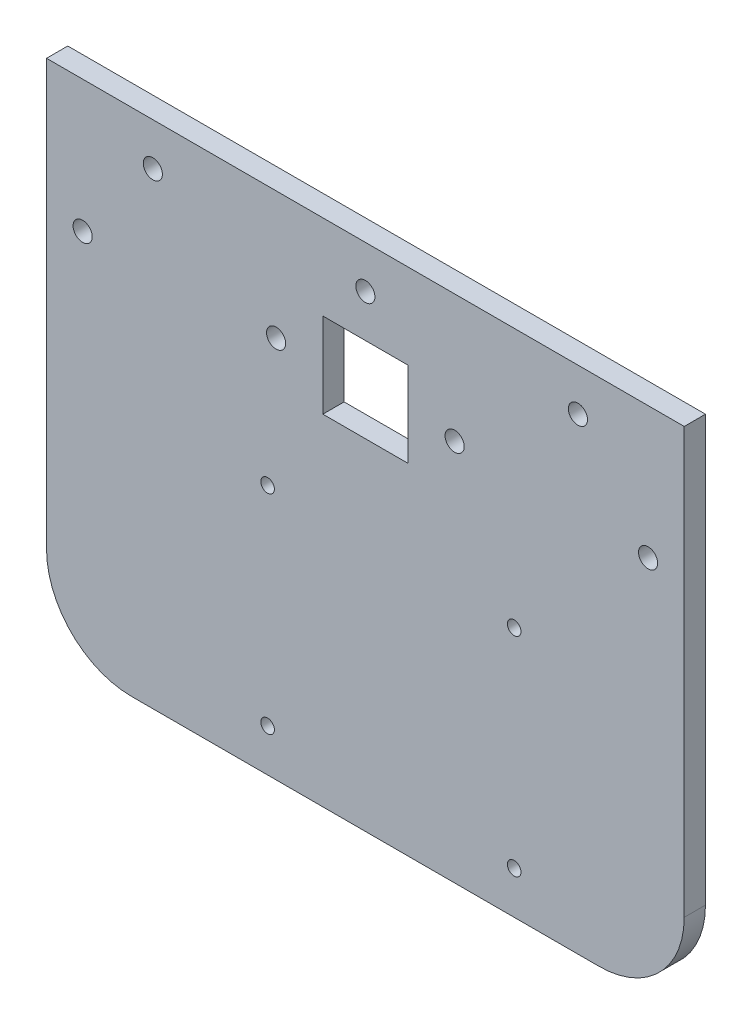
ISO-10303-21;
HEADER;
FILE_DESCRIPTION(('STEP AP214'),'2;1');
FILE_NAME('part.step','',(''),(''),'','','');
FILE_SCHEMA(('AUTOMOTIVE_DESIGN { 1 0 10303 214 1 1 1 1 }'));
ENDSEC;
DATA;
#1=APPLICATION_CONTEXT('core data for automotive mechanical design processes');
#2=APPLICATION_PROTOCOL_DEFINITION('international standard','automotive_design',2000,#1);
#3=PRODUCT_CONTEXT('',#1,'mechanical');
#4=PRODUCT('Part','Part','',(#3));
#5=PRODUCT_RELATED_PRODUCT_CATEGORY('part','',(#4));
#6=PRODUCT_DEFINITION_FORMATION('','',#4);
#7=PRODUCT_DEFINITION_CONTEXT('part definition',#1,'design');
#8=PRODUCT_DEFINITION('design','',#6,#7);
#9=PRODUCT_DEFINITION_SHAPE('','',#8);
#10=(LENGTH_UNIT() NAMED_UNIT(*) SI_UNIT(.MILLI.,.METRE.));
#11=(NAMED_UNIT(*) PLANE_ANGLE_UNIT() SI_UNIT($,.RADIAN.));
#12=(NAMED_UNIT(*) SI_UNIT($,.STERADIAN.) SOLID_ANGLE_UNIT());
#13=UNCERTAINTY_MEASURE_WITH_UNIT(LENGTH_MEASURE(1.E-05),#10,'distance_accuracy_value','');
#14=(GEOMETRIC_REPRESENTATION_CONTEXT(3) GLOBAL_UNCERTAINTY_ASSIGNED_CONTEXT((#13)) GLOBAL_UNIT_ASSIGNED_CONTEXT((#10,
#11,#12)) REPRESENTATION_CONTEXT('',''));
#15=CARTESIAN_POINT('',(0.,0.,0.));
#16=DIRECTION('',(0.,0.,1.));
#17=DIRECTION('',(1.,0.,0.));
#18=AXIS2_PLACEMENT_3D('',#15,#16,#17);
#19=CARTESIAN_POINT('',(20.,-100.,5.));
#20=DIRECTION('',(0.,0.,1.));
#21=DIRECTION('',(1.,0.,0.));
#22=AXIS2_PLACEMENT_3D('',#19,#20,#21);
#23=PLANE('',#22);
#24=CARTESIAN_POINT('',(54.,-30.,5.));
#25=DIRECTION('',(0.,0.,1.));
#26=DIRECTION('',(1.,0.,0.));
#27=AXIS2_PLACEMENT_3D('',#24,#25,#26);
#28=CIRCLE('',#27,2.25);
#29=CARTESIAN_POINT('',(56.25,-30.,5.));
#30=VERTEX_POINT('',#29);
#31=EDGE_CURVE('E339',#30,#30,#28,.T.);
#32=ORIENTED_EDGE('',*,*,#31,.F.);
#33=EDGE_LOOP('',(#32));
#34=FACE_BOUND('',#33,.T.);
#35=CARTESIAN_POINT('',(125.,-9.99999999999999,5.));
#36=DIRECTION('',(0.,0.,1.));
#37=DIRECTION('',(1.,0.,0.));
#38=AXIS2_PLACEMENT_3D('',#35,#36,#37);
#39=CIRCLE('',#38,2.25000000000001);
#40=CARTESIAN_POINT('',(127.25,-9.99999999999999,5.));
#41=VERTEX_POINT('',#40);
#42=EDGE_CURVE('E355',#41,#41,#39,.T.);
#43=ORIENTED_EDGE('',*,*,#42,.F.);
#44=EDGE_LOOP('',(#43));
#45=FACE_BOUND('',#44,.T.);
#46=CARTESIAN_POINT('',(141.5,-31.,5.));
#47=DIRECTION('',(0.,0.,1.));
#48=DIRECTION('',(1.,0.,0.));
#49=AXIS2_PLACEMENT_3D('',#46,#47,#48);
#50=CIRCLE('',#49,2.25000000000001);
#51=CARTESIAN_POINT('',(143.75,-31.,5.));
#52=VERTEX_POINT('',#51);
#53=EDGE_CURVE('E371',#52,#52,#50,.T.);
#54=ORIENTED_EDGE('',*,*,#53,.F.);
#55=EDGE_LOOP('',(#54));
#56=FACE_BOUND('',#55,.T.);
#57=CARTESIAN_POINT('',(52.,-110.,5.));
#58=DIRECTION('',(0.,0.,1.));
#59=DIRECTION('',(1.,0.,0.));
#60=AXIS2_PLACEMENT_3D('',#57,#58,#59);
#61=CIRCLE('',#60,1.6);
#62=CARTESIAN_POINT('',(53.6,-110.,5.));
#63=VERTEX_POINT('',#62);
#64=EDGE_CURVE('E387',#63,#63,#61,.T.);
#65=ORIENTED_EDGE('',*,*,#64,.F.);
#66=EDGE_LOOP('',(#65));
#67=FACE_BOUND('',#66,.T.);
#68=CARTESIAN_POINT('',(110.,-61.,5.));
#69=DIRECTION('',(0.,0.,1.));
#70=DIRECTION('',(1.,0.,0.));
#71=AXIS2_PLACEMENT_3D('',#68,#69,#70);
#72=CIRCLE('',#71,1.60000000000001);
#73=CARTESIAN_POINT('',(111.6,-61.,5.));
#74=VERTEX_POINT('',#73);
#75=EDGE_CURVE('E403',#74,#74,#72,.T.);
#76=ORIENTED_EDGE('',*,*,#75,.F.);
#77=EDGE_LOOP('',(#76));
#78=FACE_BOUND('',#77,.T.);
#79=DIRECTION('',(1.,0.,0.));
#80=VECTOR('',#79,1.);
#81=CARTESIAN_POINT('',(65.,-40.,5.));
#82=LINE('',#81,#80);
#83=CARTESIAN_POINT('',(65.,-40.,5.));
#84=VERTEX_POINT('',#83);
#85=CARTESIAN_POINT('',(85.,-40.,5.));
#86=VERTEX_POINT('',#85);
#87=EDGE_CURVE('E126',#84,#86,#82,.T.);
#88=ORIENTED_EDGE('',*,*,#87,.F.);
#89=DIRECTION('',(0.,-1.,0.));
#90=VECTOR('',#89,1.);
#91=CARTESIAN_POINT('',(65.,-20.,5.));
#92=LINE('',#91,#90);
#93=CARTESIAN_POINT('',(65.,-20.,5.));
#94=VERTEX_POINT('',#93);
#95=EDGE_CURVE('E117',#94,#84,#92,.T.);
#96=ORIENTED_EDGE('',*,*,#95,.F.);
#97=DIRECTION('',(-1.,0.,0.));
#98=VECTOR('',#97,1.);
#99=CARTESIAN_POINT('',(65.,-20.,5.));
#100=LINE('',#99,#98);
#101=CARTESIAN_POINT('',(85.,-20.,5.));
#102=VERTEX_POINT('',#101);
#103=EDGE_CURVE('E144',#102,#94,#100,.T.);
#104=ORIENTED_EDGE('',*,*,#103,.F.);
#105=DIRECTION('',(0.,1.,0.));
#106=VECTOR('',#105,1.);
#107=CARTESIAN_POINT('',(85.,-20.,5.));
#108=LINE('',#107,#106);
#109=EDGE_CURVE('E140',#86,#102,#108,.T.);
#110=ORIENTED_EDGE('',*,*,#109,.F.);
#111=EDGE_LOOP('',(#88,#96,#104,#110));
#112=FACE_BOUND('',#111,.T.);
#113=DIRECTION('',(0.,-1.,0.));
#114=VECTOR('',#113,1.);
#115=CARTESIAN_POINT('',(0.,0.,5.));
#116=LINE('',#115,#114);
#117=CARTESIAN_POINT('',(0.,0.,5.));
#118=VERTEX_POINT('',#117);
#119=CARTESIAN_POINT('',(0.,-100.,5.));
#120=VERTEX_POINT('',#119);
#121=EDGE_CURVE('E168',#118,#120,#116,.T.);
#122=ORIENTED_EDGE('',*,*,#121,.T.);
#123=CARTESIAN_POINT('',(20.,-100.,5.));
#124=DIRECTION('',(0.,0.,1.));
#125=DIRECTION('',(1.,0.,0.));
#126=AXIS2_PLACEMENT_3D('',#123,#124,#125);
#127=CIRCLE('',#126,20.);
#128=CARTESIAN_POINT('',(20.,-120.,5.));
#129=VERTEX_POINT('',#128);
#130=EDGE_CURVE('E172',#120,#129,#127,.T.);
#131=ORIENTED_EDGE('',*,*,#130,.T.);
#132=DIRECTION('',(1.,0.,0.));
#133=VECTOR('',#132,1.);
#134=CARTESIAN_POINT('',(20.,-120.,5.));
#135=LINE('',#134,#133);
#136=CARTESIAN_POINT('',(130.,-120.,5.));
#137=VERTEX_POINT('',#136);
#138=EDGE_CURVE('E176',#129,#137,#135,.T.);
#139=ORIENTED_EDGE('',*,*,#138,.T.);
#140=CARTESIAN_POINT('',(130.,-100.,5.));
#141=DIRECTION('',(0.,0.,1.));
#142=DIRECTION('',(1.,0.,0.));
#143=AXIS2_PLACEMENT_3D('',#140,#141,#142);
#144=CIRCLE('',#143,20.);
#145=CARTESIAN_POINT('',(150.,-100.,5.));
#146=VERTEX_POINT('',#145);
#147=EDGE_CURVE('E179',#137,#146,#144,.T.);
#148=ORIENTED_EDGE('',*,*,#147,.T.);
#149=DIRECTION('',(0.,1.,0.));
#150=VECTOR('',#149,1.);
#151=CARTESIAN_POINT('',(150.,0.,5.));
#152=LINE('',#151,#150);
#153=CARTESIAN_POINT('',(150.,0.,5.));
#154=VERTEX_POINT('',#153);
#155=EDGE_CURVE('E182',#146,#154,#152,.T.);
#156=ORIENTED_EDGE('',*,*,#155,.T.);
#157=DIRECTION('',(-1.,0.,0.));
#158=VECTOR('',#157,1.);
#159=CARTESIAN_POINT('',(0.,0.,5.));
#160=LINE('',#159,#158);
#161=EDGE_CURVE('E185',#154,#118,#160,.T.);
#162=ORIENTED_EDGE('',*,*,#161,.T.);
#163=EDGE_LOOP('',(#122,#131,#139,#148,#156,#162));
#164=FACE_BOUND('',#163,.T.);
#165=CARTESIAN_POINT('',(52.,-61.,5.));
#166=DIRECTION('',(0.,0.,1.));
#167=DIRECTION('',(1.,0.,0.));
#168=AXIS2_PLACEMENT_3D('',#165,#166,#167);
#169=CIRCLE('',#168,1.6);
#170=CARTESIAN_POINT('',(53.6,-61.,5.));
#171=VERTEX_POINT('',#170);
#172=EDGE_CURVE('E152',#171,#171,#169,.T.);
#173=ORIENTED_EDGE('',*,*,#172,.F.);
#174=EDGE_LOOP('',(#173));
#175=FACE_BOUND('',#174,.T.);
#176=CARTESIAN_POINT('',(110.,-110.,5.));
#177=DIRECTION('',(0.,0.,1.));
#178=DIRECTION('',(1.,0.,0.));
#179=AXIS2_PLACEMENT_3D('',#176,#177,#178);
#180=CIRCLE('',#179,1.60000000000001);
#181=CARTESIAN_POINT('',(111.6,-110.,5.));
#182=VERTEX_POINT('',#181);
#183=EDGE_CURVE('E395',#182,#182,#180,.T.);
#184=ORIENTED_EDGE('',*,*,#183,.F.);
#185=EDGE_LOOP('',(#184));
#186=FACE_BOUND('',#185,.T.);
#187=CARTESIAN_POINT('',(8.5,-31.,5.));
#188=DIRECTION('',(0.,0.,1.));
#189=DIRECTION('',(1.,0.,0.));
#190=AXIS2_PLACEMENT_3D('',#187,#188,#189);
#191=CIRCLE('',#190,2.25);
#192=CARTESIAN_POINT('',(10.75,-31.,5.));
#193=VERTEX_POINT('',#192);
#194=EDGE_CURVE('E379',#193,#193,#191,.T.);
#195=ORIENTED_EDGE('',*,*,#194,.F.);
#196=EDGE_LOOP('',(#195));
#197=FACE_BOUND('',#196,.T.);
#198=CARTESIAN_POINT('',(25.,-10.,5.));
#199=DIRECTION('',(0.,0.,1.));
#200=DIRECTION('',(1.,0.,0.));
#201=AXIS2_PLACEMENT_3D('',#198,#199,#200);
#202=CIRCLE('',#201,2.25);
#203=CARTESIAN_POINT('',(27.25,-10.,5.));
#204=VERTEX_POINT('',#203);
#205=EDGE_CURVE('E363',#204,#204,#202,.T.);
#206=ORIENTED_EDGE('',*,*,#205,.F.);
#207=EDGE_LOOP('',(#206));
#208=FACE_BOUND('',#207,.T.);
#209=CARTESIAN_POINT('',(96.,-30.,5.));
#210=DIRECTION('',(0.,0.,1.));
#211=DIRECTION('',(1.,0.,0.));
#212=AXIS2_PLACEMENT_3D('',#209,#210,#211);
#213=CIRCLE('',#212,2.25);
#214=CARTESIAN_POINT('',(98.25,-30.,5.));
#215=VERTEX_POINT('',#214);
#216=EDGE_CURVE('E347',#215,#215,#213,.T.);
#217=ORIENTED_EDGE('',*,*,#216,.F.);
#218=EDGE_LOOP('',(#217));
#219=FACE_BOUND('',#218,.T.);
#220=CARTESIAN_POINT('',(75.,-9.99999999999999,5.));
#221=DIRECTION('',(0.,0.,1.));
#222=DIRECTION('',(1.,0.,0.));
#223=AXIS2_PLACEMENT_3D('',#220,#221,#222);
#224=CIRCLE('',#223,2.25);
#225=CARTESIAN_POINT('',(77.25,-9.99999999999999,5.));
#226=VERTEX_POINT('',#225);
#227=EDGE_CURVE('E328',#226,#226,#224,.T.);
#228=ORIENTED_EDGE('',*,*,#227,.F.);
#229=EDGE_LOOP('',(#228));
#230=FACE_BOUND('',#229,.T.);
#231=ADVANCED_FACE('F39',(#34,#45,#56,#67,#78,#112,#164,#175,#186,#197,#208,#219,#230),#23,.T.);
#232=CARTESIAN_POINT('',(20.,-100.,0.));
#233=DIRECTION('',(0.,0.,1.));
#234=DIRECTION('',(1.,0.,0.));
#235=AXIS2_PLACEMENT_3D('',#232,#233,#234);
#236=PLANE('',#235);
#237=DIRECTION('',(0.,-1.,0.));
#238=VECTOR('',#237,1.);
#239=CARTESIAN_POINT('',(0.,0.,0.));
#240=LINE('',#239,#238);
#241=CARTESIAN_POINT('',(0.,0.,0.));
#242=VERTEX_POINT('',#241);
#243=CARTESIAN_POINT('',(0.,-100.,0.));
#244=VERTEX_POINT('',#243);
#245=EDGE_CURVE('E135',#242,#244,#240,.T.);
#246=ORIENTED_EDGE('',*,*,#245,.F.);
#247=DIRECTION('',(-1.,0.,0.));
#248=VECTOR('',#247,1.);
#249=CARTESIAN_POINT('',(0.,0.,0.));
#250=LINE('',#249,#248);
#251=CARTESIAN_POINT('',(150.,0.,0.));
#252=VERTEX_POINT('',#251);
#253=EDGE_CURVE('E173',#252,#242,#250,.T.);
#254=ORIENTED_EDGE('',*,*,#253,.F.);
#255=DIRECTION('',(0.,1.,0.));
#256=VECTOR('',#255,1.);
#257=CARTESIAN_POINT('',(150.,0.,0.));
#258=LINE('',#257,#256);
#259=CARTESIAN_POINT('',(150.,-100.,0.));
#260=VERTEX_POINT('',#259);
#261=EDGE_CURVE('E201',#260,#252,#258,.T.);
#262=ORIENTED_EDGE('',*,*,#261,.F.);
#263=CARTESIAN_POINT('',(130.,-100.,0.));
#264=DIRECTION('',(0.,0.,1.));
#265=DIRECTION('',(1.,0.,0.));
#266=AXIS2_PLACEMENT_3D('',#263,#264,#265);
#267=CIRCLE('',#266,20.);
#268=CARTESIAN_POINT('',(130.,-120.,0.));
#269=VERTEX_POINT('',#268);
#270=EDGE_CURVE('E198',#269,#260,#267,.T.);
#271=ORIENTED_EDGE('',*,*,#270,.F.);
#272=DIRECTION('',(1.,0.,0.));
#273=VECTOR('',#272,1.);
#274=CARTESIAN_POINT('',(20.,-120.,0.));
#275=LINE('',#274,#273);
#276=CARTESIAN_POINT('',(20.,-120.,0.));
#277=VERTEX_POINT('',#276);
#278=EDGE_CURVE('E195',#277,#269,#275,.T.);
#279=ORIENTED_EDGE('',*,*,#278,.F.);
#280=CARTESIAN_POINT('',(20.,-100.,0.));
#281=DIRECTION('',(0.,0.,1.));
#282=DIRECTION('',(1.,0.,0.));
#283=AXIS2_PLACEMENT_3D('',#280,#281,#282);
#284=CIRCLE('',#283,20.);
#285=EDGE_CURVE('E192',#244,#277,#284,.T.);
#286=ORIENTED_EDGE('',*,*,#285,.F.);
#287=EDGE_LOOP('',(#246,#254,#262,#271,#279,#286));
#288=FACE_BOUND('',#287,.T.);
#289=DIRECTION('',(0.,-1.,0.));
#290=VECTOR('',#289,1.);
#291=CARTESIAN_POINT('',(65.,-20.,0.));
#292=LINE('',#291,#290);
#293=CARTESIAN_POINT('',(65.,-20.,0.));
#294=VERTEX_POINT('',#293);
#295=CARTESIAN_POINT('',(65.,-40.,0.));
#296=VERTEX_POINT('',#295);
#297=EDGE_CURVE('E63',#294,#296,#292,.T.);
#298=ORIENTED_EDGE('',*,*,#297,.T.);
#299=DIRECTION('',(1.,0.,0.));
#300=VECTOR('',#299,1.);
#301=CARTESIAN_POINT('',(65.,-40.,0.));
#302=LINE('',#301,#300);
#303=CARTESIAN_POINT('',(85.,-40.,0.));
#304=VERTEX_POINT('',#303);
#305=EDGE_CURVE('E133',#296,#304,#302,.T.);
#306=ORIENTED_EDGE('',*,*,#305,.T.);
#307=DIRECTION('',(0.,1.,0.));
#308=VECTOR('',#307,1.);
#309=CARTESIAN_POINT('',(85.,-20.,0.));
#310=LINE('',#309,#308);
#311=CARTESIAN_POINT('',(85.,-20.,0.));
#312=VERTEX_POINT('',#311);
#313=EDGE_CURVE('E155',#304,#312,#310,.T.);
#314=ORIENTED_EDGE('',*,*,#313,.T.);
#315=DIRECTION('',(-1.,0.,0.));
#316=VECTOR('',#315,1.);
#317=CARTESIAN_POINT('',(65.,-20.,0.));
#318=LINE('',#317,#316);
#319=EDGE_CURVE('E127',#312,#294,#318,.T.);
#320=ORIENTED_EDGE('',*,*,#319,.T.);
#321=EDGE_LOOP('',(#298,#306,#314,#320));
#322=FACE_BOUND('',#321,.T.);
#323=CARTESIAN_POINT('',(52.,-61.,0.));
#324=DIRECTION('',(0.,0.,1.));
#325=DIRECTION('',(1.,0.,0.));
#326=AXIS2_PLACEMENT_3D('',#323,#324,#325);
#327=CIRCLE('',#326,1.6);
#328=CARTESIAN_POINT('',(53.6,-61.,0.));
#329=VERTEX_POINT('',#328);
#330=EDGE_CURVE('E407',#329,#329,#327,.T.);
#331=ORIENTED_EDGE('',*,*,#330,.T.);
#332=EDGE_LOOP('',(#331));
#333=FACE_BOUND('',#332,.T.);
#334=CARTESIAN_POINT('',(110.,-61.,0.));
#335=DIRECTION('',(0.,0.,1.));
#336=DIRECTION('',(1.,0.,0.));
#337=AXIS2_PLACEMENT_3D('',#334,#335,#336);
#338=CIRCLE('',#337,1.60000000000001);
#339=CARTESIAN_POINT('',(111.6,-61.,0.));
#340=VERTEX_POINT('',#339);
#341=EDGE_CURVE('E399',#340,#340,#338,.T.);
#342=ORIENTED_EDGE('',*,*,#341,.T.);
#343=EDGE_LOOP('',(#342));
#344=FACE_BOUND('',#343,.T.);
#345=CARTESIAN_POINT('',(110.,-110.,0.));
#346=DIRECTION('',(0.,0.,1.));
#347=DIRECTION('',(1.,0.,0.));
#348=AXIS2_PLACEMENT_3D('',#345,#346,#347);
#349=CIRCLE('',#348,1.60000000000001);
#350=CARTESIAN_POINT('',(111.6,-110.,0.));
#351=VERTEX_POINT('',#350);
#352=EDGE_CURVE('E391',#351,#351,#349,.T.);
#353=ORIENTED_EDGE('',*,*,#352,.T.);
#354=EDGE_LOOP('',(#353));
#355=FACE_BOUND('',#354,.T.);
#356=CARTESIAN_POINT('',(52.,-110.,0.));
#357=DIRECTION('',(0.,0.,1.));
#358=DIRECTION('',(1.,0.,0.));
#359=AXIS2_PLACEMENT_3D('',#356,#357,#358);
#360=CIRCLE('',#359,1.6);
#361=CARTESIAN_POINT('',(53.6,-110.,0.));
#362=VERTEX_POINT('',#361);
#363=EDGE_CURVE('E383',#362,#362,#360,.T.);
#364=ORIENTED_EDGE('',*,*,#363,.T.);
#365=EDGE_LOOP('',(#364));
#366=FACE_BOUND('',#365,.T.);
#367=CARTESIAN_POINT('',(8.5,-31.,0.));
#368=DIRECTION('',(0.,0.,1.));
#369=DIRECTION('',(1.,0.,0.));
#370=AXIS2_PLACEMENT_3D('',#367,#368,#369);
#371=CIRCLE('',#370,2.25);
#372=CARTESIAN_POINT('',(10.75,-31.,0.));
#373=VERTEX_POINT('',#372);
#374=EDGE_CURVE('E375',#373,#373,#371,.T.);
#375=ORIENTED_EDGE('',*,*,#374,.T.);
#376=EDGE_LOOP('',(#375));
#377=FACE_BOUND('',#376,.T.);
#378=CARTESIAN_POINT('',(141.5,-31.,0.));
#379=DIRECTION('',(0.,0.,1.));
#380=DIRECTION('',(1.,0.,0.));
#381=AXIS2_PLACEMENT_3D('',#378,#379,#380);
#382=CIRCLE('',#381,2.25000000000001);
#383=CARTESIAN_POINT('',(143.75,-31.,0.));
#384=VERTEX_POINT('',#383);
#385=EDGE_CURVE('E367',#384,#384,#382,.T.);
#386=ORIENTED_EDGE('',*,*,#385,.T.);
#387=EDGE_LOOP('',(#386));
#388=FACE_BOUND('',#387,.T.);
#389=CARTESIAN_POINT('',(25.,-10.,0.));
#390=DIRECTION('',(0.,0.,1.));
#391=DIRECTION('',(1.,0.,0.));
#392=AXIS2_PLACEMENT_3D('',#389,#390,#391);
#393=CIRCLE('',#392,2.25);
#394=CARTESIAN_POINT('',(27.25,-10.,0.));
#395=VERTEX_POINT('',#394);
#396=EDGE_CURVE('E359',#395,#395,#393,.T.);
#397=ORIENTED_EDGE('',*,*,#396,.T.);
#398=EDGE_LOOP('',(#397));
#399=FACE_BOUND('',#398,.T.);
#400=CARTESIAN_POINT('',(125.,-9.99999999999999,0.));
#401=DIRECTION('',(0.,0.,1.));
#402=DIRECTION('',(1.,0.,0.));
#403=AXIS2_PLACEMENT_3D('',#400,#401,#402);
#404=CIRCLE('',#403,2.25000000000001);
#405=CARTESIAN_POINT('',(127.25,-9.99999999999999,0.));
#406=VERTEX_POINT('',#405);
#407=EDGE_CURVE('E351',#406,#406,#404,.T.);
#408=ORIENTED_EDGE('',*,*,#407,.T.);
#409=EDGE_LOOP('',(#408));
#410=FACE_BOUND('',#409,.T.);
#411=CARTESIAN_POINT('',(96.,-30.,0.));
#412=DIRECTION('',(0.,0.,1.));
#413=DIRECTION('',(1.,0.,0.));
#414=AXIS2_PLACEMENT_3D('',#411,#412,#413);
#415=CIRCLE('',#414,2.25);
#416=CARTESIAN_POINT('',(98.25,-30.,0.));
#417=VERTEX_POINT('',#416);
#418=EDGE_CURVE('E343',#417,#417,#415,.T.);
#419=ORIENTED_EDGE('',*,*,#418,.T.);
#420=EDGE_LOOP('',(#419));
#421=FACE_BOUND('',#420,.T.);
#422=CARTESIAN_POINT('',(54.,-30.,0.));
#423=DIRECTION('',(0.,0.,1.));
#424=DIRECTION('',(1.,0.,0.));
#425=AXIS2_PLACEMENT_3D('',#422,#423,#424);
#426=CIRCLE('',#425,2.25);
#427=CARTESIAN_POINT('',(56.25,-30.,0.));
#428=VERTEX_POINT('',#427);
#429=EDGE_CURVE('E336',#428,#428,#426,.T.);
#430=ORIENTED_EDGE('',*,*,#429,.T.);
#431=EDGE_LOOP('',(#430));
#432=FACE_BOUND('',#431,.T.);
#433=CARTESIAN_POINT('',(75.,-9.99999999999999,0.));
#434=DIRECTION('',(0.,0.,1.));
#435=DIRECTION('',(1.,0.,0.));
#436=AXIS2_PLACEMENT_3D('',#433,#434,#435);
#437=CIRCLE('',#436,2.25);
#438=CARTESIAN_POINT('',(77.25,-9.99999999999999,0.));
#439=VERTEX_POINT('',#438);
#440=EDGE_CURVE('E331',#439,#439,#437,.T.);
#441=ORIENTED_EDGE('',*,*,#440,.T.);
#442=EDGE_LOOP('',(#441));
#443=FACE_BOUND('',#442,.T.);
#444=ADVANCED_FACE('F232',(#288,#322,#333,#344,#355,#366,#377,#388,#399,#410,#421,#432,#443),
#236,.F.);
#445=CARTESIAN_POINT('',(0.,0.,5.));
#446=DIRECTION('',(1.,0.,0.));
#447=DIRECTION('',(0.,1.,0.));
#448=AXIS2_PLACEMENT_3D('',#445,#446,#447);
#449=PLANE('',#448);
#450=ORIENTED_EDGE('',*,*,#245,.T.);
#451=DIRECTION('',(0.,0.,-1.));
#452=VECTOR('',#451,1.);
#453=CARTESIAN_POINT('',(0.,-100.,5.));
#454=LINE('',#453,#452);
#455=EDGE_CURVE('E11',#120,#244,#454,.T.);
#456=ORIENTED_EDGE('',*,*,#455,.F.);
#457=ORIENTED_EDGE('',*,*,#121,.F.);
#458=DIRECTION('',(0.,0.,-1.));
#459=VECTOR('',#458,1.);
#460=CARTESIAN_POINT('',(0.,0.,5.));
#461=LINE('',#460,#459);
#462=EDGE_CURVE('E188',#118,#242,#461,.T.);
#463=ORIENTED_EDGE('',*,*,#462,.T.);
#464=EDGE_LOOP('',(#450,#456,#457,#463));
#465=FACE_BOUND('',#464,.T.);
#466=ADVANCED_FACE('F41',(#465),#449,.F.);
#467=CARTESIAN_POINT('',(20.,-100.,5.));
#468=DIRECTION('',(0.,0.,-1.));
#469=DIRECTION('',(-1.,0.,0.));
#470=AXIS2_PLACEMENT_3D('',#467,#468,#469);
#471=CYLINDRICAL_SURFACE('',#470,20.);
#472=ORIENTED_EDGE('',*,*,#285,.T.);
#473=DIRECTION('',(0.,0.,-1.));
#474=VECTOR('',#473,1.);
#475=CARTESIAN_POINT('',(20.,-120.,5.));
#476=LINE('',#475,#474);
#477=EDGE_CURVE('E48',#129,#277,#476,.T.);
#478=ORIENTED_EDGE('',*,*,#477,.F.);
#479=ORIENTED_EDGE('',*,*,#130,.F.);
#480=ORIENTED_EDGE('',*,*,#455,.T.);
#481=EDGE_LOOP('',(#472,#478,#479,#480));
#482=FACE_BOUND('',#481,.T.);
#483=ADVANCED_FACE('F249',(#482),#471,.T.);
#484=CARTESIAN_POINT('',(20.,-120.,5.));
#485=DIRECTION('',(0.,1.,0.));
#486=DIRECTION('',(-1.,0.,0.));
#487=AXIS2_PLACEMENT_3D('',#484,#485,#486);
#488=PLANE('',#487);
#489=ORIENTED_EDGE('',*,*,#278,.T.);
#490=DIRECTION('',(0.,0.,-1.));
#491=VECTOR('',#490,1.);
#492=CARTESIAN_POINT('',(130.,-120.,5.));
#493=LINE('',#492,#491);
#494=EDGE_CURVE('E217',#137,#269,#493,.T.);
#495=ORIENTED_EDGE('',*,*,#494,.F.);
#496=ORIENTED_EDGE('',*,*,#138,.F.);
#497=ORIENTED_EDGE('',*,*,#477,.T.);
#498=EDGE_LOOP('',(#489,#495,#496,#497));
#499=FACE_BOUND('',#498,.T.);
#500=ADVANCED_FACE('F226',(#499),#488,.F.);
#501=CARTESIAN_POINT('',(130.,-100.,5.));
#502=DIRECTION('',(0.,0.,-1.));
#503=DIRECTION('',(-1.,0.,0.));
#504=AXIS2_PLACEMENT_3D('',#501,#502,#503);
#505=CYLINDRICAL_SURFACE('',#504,20.);
#506=ORIENTED_EDGE('',*,*,#270,.T.);
#507=DIRECTION('',(0.,0.,-1.));
#508=VECTOR('',#507,1.);
#509=CARTESIAN_POINT('',(150.,-100.,5.));
#510=LINE('',#509,#508);
#511=EDGE_CURVE('E213',#146,#260,#510,.T.);
#512=ORIENTED_EDGE('',*,*,#511,.F.);
#513=ORIENTED_EDGE('',*,*,#147,.F.);
#514=ORIENTED_EDGE('',*,*,#494,.T.);
#515=EDGE_LOOP('',(#506,#512,#513,#514));
#516=FACE_BOUND('',#515,.T.);
#517=ADVANCED_FACE('F238',(#516),#505,.T.);
#518=CARTESIAN_POINT('',(150.,0.,5.));
#519=DIRECTION('',(-1.,0.,0.));
#520=DIRECTION('',(0.,-1.,0.));
#521=AXIS2_PLACEMENT_3D('',#518,#519,#520);
#522=PLANE('',#521);
#523=ORIENTED_EDGE('',*,*,#261,.T.);
#524=DIRECTION('',(0.,0.,-1.));
#525=VECTOR('',#524,1.);
#526=CARTESIAN_POINT('',(150.,0.,5.));
#527=LINE('',#526,#525);
#528=EDGE_CURVE('E209',#154,#252,#527,.T.);
#529=ORIENTED_EDGE('',*,*,#528,.F.);
#530=ORIENTED_EDGE('',*,*,#155,.F.);
#531=ORIENTED_EDGE('',*,*,#511,.T.);
#532=EDGE_LOOP('',(#523,#529,#530,#531));
#533=FACE_BOUND('',#532,.T.);
#534=ADVANCED_FACE('F242',(#533),#522,.F.);
#535=CARTESIAN_POINT('',(0.,0.,5.));
#536=DIRECTION('',(0.,-1.,0.));
#537=DIRECTION('',(0.,0.,-1.));
#538=AXIS2_PLACEMENT_3D('',#535,#536,#537);
#539=PLANE('',#538);
#540=ORIENTED_EDGE('',*,*,#253,.T.);
#541=ORIENTED_EDGE('',*,*,#462,.F.);
#542=ORIENTED_EDGE('',*,*,#161,.F.);
#543=ORIENTED_EDGE('',*,*,#528,.T.);
#544=EDGE_LOOP('',(#540,#541,#542,#543));
#545=FACE_BOUND('',#544,.T.);
#546=ADVANCED_FACE('F252',(#545),#539,.F.);
#547=CARTESIAN_POINT('',(65.,-20.,5.));
#548=DIRECTION('',(1.,0.,0.));
#549=DIRECTION('',(0.,0.,-1.));
#550=AXIS2_PLACEMENT_3D('',#547,#548,#549);
#551=PLANE('',#550);
#552=ORIENTED_EDGE('',*,*,#297,.F.);
#553=DIRECTION('',(0.,0.,-1.));
#554=VECTOR('',#553,1.);
#555=CARTESIAN_POINT('',(65.,-20.,5.));
#556=LINE('',#555,#554);
#557=EDGE_CURVE('E121',#94,#294,#556,.T.);
#558=ORIENTED_EDGE('',*,*,#557,.F.);
#559=ORIENTED_EDGE('',*,*,#95,.T.);
#560=DIRECTION('',(0.,0.,-1.));
#561=VECTOR('',#560,1.);
#562=CARTESIAN_POINT('',(65.,-40.,5.));
#563=LINE('',#562,#561);
#564=EDGE_CURVE('E120',#84,#296,#563,.T.);
#565=ORIENTED_EDGE('',*,*,#564,.T.);
#566=EDGE_LOOP('',(#552,#558,#559,#565));
#567=FACE_BOUND('',#566,.T.);
#568=ADVANCED_FACE('F119',(#567),#551,.T.);
#569=CARTESIAN_POINT('',(65.,-40.,5.));
#570=DIRECTION('',(0.,1.,0.));
#571=DIRECTION('',(0.,0.,1.));
#572=AXIS2_PLACEMENT_3D('',#569,#570,#571);
#573=PLANE('',#572);
#574=ORIENTED_EDGE('',*,*,#305,.F.);
#575=ORIENTED_EDGE('',*,*,#564,.F.);
#576=ORIENTED_EDGE('',*,*,#87,.T.);
#577=DIRECTION('',(0.,0.,-1.));
#578=VECTOR('',#577,1.);
#579=CARTESIAN_POINT('',(85.,-40.,5.));
#580=LINE('',#579,#578);
#581=EDGE_CURVE('E136',#86,#304,#580,.T.);
#582=ORIENTED_EDGE('',*,*,#581,.T.);
#583=EDGE_LOOP('',(#574,#575,#576,#582));
#584=FACE_BOUND('',#583,.T.);
#585=ADVANCED_FACE('F130',(#584),#573,.T.);
#586=CARTESIAN_POINT('',(85.,-20.,5.));
#587=DIRECTION('',(-1.,0.,0.));
#588=DIRECTION('',(0.,0.,1.));
#589=AXIS2_PLACEMENT_3D('',#586,#587,#588);
#590=PLANE('',#589);
#591=ORIENTED_EDGE('',*,*,#313,.F.);
#592=ORIENTED_EDGE('',*,*,#581,.F.);
#593=ORIENTED_EDGE('',*,*,#109,.T.);
#594=DIRECTION('',(0.,0.,-1.));
#595=VECTOR('',#594,1.);
#596=CARTESIAN_POINT('',(85.,-20.,5.));
#597=LINE('',#596,#595);
#598=EDGE_CURVE('E55',#102,#312,#597,.T.);
#599=ORIENTED_EDGE('',*,*,#598,.T.);
#600=EDGE_LOOP('',(#591,#592,#593,#599));
#601=FACE_BOUND('',#600,.T.);
#602=ADVANCED_FACE('F273',(#601),#590,.T.);
#603=CARTESIAN_POINT('',(65.,-20.,5.));
#604=DIRECTION('',(0.,-1.,0.));
#605=DIRECTION('',(0.,0.,-1.));
#606=AXIS2_PLACEMENT_3D('',#603,#604,#605);
#607=PLANE('',#606);
#608=ORIENTED_EDGE('',*,*,#319,.F.);
#609=ORIENTED_EDGE('',*,*,#598,.F.);
#610=ORIENTED_EDGE('',*,*,#103,.T.);
#611=ORIENTED_EDGE('',*,*,#557,.T.);
#612=EDGE_LOOP('',(#608,#609,#610,#611));
#613=FACE_BOUND('',#612,.T.);
#614=ADVANCED_FACE('F276',(#613),#607,.T.);
#615=CARTESIAN_POINT('',(52.,-61.,5.));
#616=DIRECTION('',(0.,0.,-1.));
#617=DIRECTION('',(-1.,0.,0.));
#618=AXIS2_PLACEMENT_3D('',#615,#616,#617);
#619=CYLINDRICAL_SURFACE('',#618,1.6);
#620=ORIENTED_EDGE('',*,*,#172,.T.);
#621=EDGE_LOOP('',(#620));
#622=FACE_BOUND('',#621,.T.);
#623=ORIENTED_EDGE('',*,*,#330,.F.);
#624=EDGE_LOOP('',(#623));
#625=FACE_BOUND('',#624,.T.);
#626=ADVANCED_FACE('F280',(#622,#625),#619,.F.);
#627=CARTESIAN_POINT('',(110.,-61.,5.));
#628=DIRECTION('',(0.,0.,-1.));
#629=DIRECTION('',(-1.,0.,0.));
#630=AXIS2_PLACEMENT_3D('',#627,#628,#629);
#631=CYLINDRICAL_SURFACE('',#630,1.60000000000001);
#632=ORIENTED_EDGE('',*,*,#75,.T.);
#633=EDGE_LOOP('',(#632));
#634=FACE_BOUND('',#633,.T.);
#635=ORIENTED_EDGE('',*,*,#341,.F.);
#636=EDGE_LOOP('',(#635));
#637=FACE_BOUND('',#636,.T.);
#638=ADVANCED_FACE('F283',(#634,#637),#631,.F.);
#639=CARTESIAN_POINT('',(110.,-110.,5.));
#640=DIRECTION('',(0.,0.,-1.));
#641=DIRECTION('',(-1.,0.,0.));
#642=AXIS2_PLACEMENT_3D('',#639,#640,#641);
#643=CYLINDRICAL_SURFACE('',#642,1.60000000000001);
#644=ORIENTED_EDGE('',*,*,#183,.T.);
#645=EDGE_LOOP('',(#644));
#646=FACE_BOUND('',#645,.T.);
#647=ORIENTED_EDGE('',*,*,#352,.F.);
#648=EDGE_LOOP('',(#647));
#649=FACE_BOUND('',#648,.T.);
#650=ADVANCED_FACE('F287',(#646,#649),#643,.F.);
#651=CARTESIAN_POINT('',(52.,-110.,5.));
#652=DIRECTION('',(0.,0.,-1.));
#653=DIRECTION('',(-1.,0.,0.));
#654=AXIS2_PLACEMENT_3D('',#651,#652,#653);
#655=CYLINDRICAL_SURFACE('',#654,1.6);
#656=ORIENTED_EDGE('',*,*,#64,.T.);
#657=EDGE_LOOP('',(#656));
#658=FACE_BOUND('',#657,.T.);
#659=ORIENTED_EDGE('',*,*,#363,.F.);
#660=EDGE_LOOP('',(#659));
#661=FACE_BOUND('',#660,.T.);
#662=ADVANCED_FACE('F291',(#658,#661),#655,.F.);
#663=CARTESIAN_POINT('',(8.5,-31.,5.));
#664=DIRECTION('',(0.,0.,-1.));
#665=DIRECTION('',(-1.,0.,0.));
#666=AXIS2_PLACEMENT_3D('',#663,#664,#665);
#667=CYLINDRICAL_SURFACE('',#666,2.25);
#668=ORIENTED_EDGE('',*,*,#194,.T.);
#669=EDGE_LOOP('',(#668));
#670=FACE_BOUND('',#669,.T.);
#671=ORIENTED_EDGE('',*,*,#374,.F.);
#672=EDGE_LOOP('',(#671));
#673=FACE_BOUND('',#672,.T.);
#674=ADVANCED_FACE('F295',(#670,#673),#667,.F.);
#675=CARTESIAN_POINT('',(141.5,-31.,5.));
#676=DIRECTION('',(0.,0.,-1.));
#677=DIRECTION('',(-1.,0.,0.));
#678=AXIS2_PLACEMENT_3D('',#675,#676,#677);
#679=CYLINDRICAL_SURFACE('',#678,2.25000000000001);
#680=ORIENTED_EDGE('',*,*,#53,.T.);
#681=EDGE_LOOP('',(#680));
#682=FACE_BOUND('',#681,.T.);
#683=ORIENTED_EDGE('',*,*,#385,.F.);
#684=EDGE_LOOP('',(#683));
#685=FACE_BOUND('',#684,.T.);
#686=ADVANCED_FACE('F299',(#682,#685),#679,.F.);
#687=CARTESIAN_POINT('',(25.,-10.,5.));
#688=DIRECTION('',(0.,0.,-1.));
#689=DIRECTION('',(-1.,0.,0.));
#690=AXIS2_PLACEMENT_3D('',#687,#688,#689);
#691=CYLINDRICAL_SURFACE('',#690,2.25);
#692=ORIENTED_EDGE('',*,*,#205,.T.);
#693=EDGE_LOOP('',(#692));
#694=FACE_BOUND('',#693,.T.);
#695=ORIENTED_EDGE('',*,*,#396,.F.);
#696=EDGE_LOOP('',(#695));
#697=FACE_BOUND('',#696,.T.);
#698=ADVANCED_FACE('F303',(#694,#697),#691,.F.);
#699=CARTESIAN_POINT('',(125.,-9.99999999999999,5.));
#700=DIRECTION('',(0.,0.,-1.));
#701=DIRECTION('',(-1.,0.,0.));
#702=AXIS2_PLACEMENT_3D('',#699,#700,#701);
#703=CYLINDRICAL_SURFACE('',#702,2.25000000000001);
#704=ORIENTED_EDGE('',*,*,#42,.T.);
#705=EDGE_LOOP('',(#704));
#706=FACE_BOUND('',#705,.T.);
#707=ORIENTED_EDGE('',*,*,#407,.F.);
#708=EDGE_LOOP('',(#707));
#709=FACE_BOUND('',#708,.T.);
#710=ADVANCED_FACE('F307',(#706,#709),#703,.F.);
#711=CARTESIAN_POINT('',(96.,-30.,5.));
#712=DIRECTION('',(0.,0.,-1.));
#713=DIRECTION('',(-1.,0.,0.));
#714=AXIS2_PLACEMENT_3D('',#711,#712,#713);
#715=CYLINDRICAL_SURFACE('',#714,2.25);
#716=ORIENTED_EDGE('',*,*,#216,.T.);
#717=EDGE_LOOP('',(#716));
#718=FACE_BOUND('',#717,.T.);
#719=ORIENTED_EDGE('',*,*,#418,.F.);
#720=EDGE_LOOP('',(#719));
#721=FACE_BOUND('',#720,.T.);
#722=ADVANCED_FACE('F311',(#718,#721),#715,.F.);
#723=CARTESIAN_POINT('',(54.,-30.,5.));
#724=DIRECTION('',(0.,0.,-1.));
#725=DIRECTION('',(-1.,0.,0.));
#726=AXIS2_PLACEMENT_3D('',#723,#724,#725);
#727=CYLINDRICAL_SURFACE('',#726,2.25);
#728=ORIENTED_EDGE('',*,*,#31,.T.);
#729=EDGE_LOOP('',(#728));
#730=FACE_BOUND('',#729,.T.);
#731=ORIENTED_EDGE('',*,*,#429,.F.);
#732=EDGE_LOOP('',(#731));
#733=FACE_BOUND('',#732,.T.);
#734=ADVANCED_FACE('F315',(#730,#733),#727,.F.);
#735=CARTESIAN_POINT('',(75.,-9.99999999999999,5.));
#736=DIRECTION('',(0.,0.,-1.));
#737=DIRECTION('',(-1.,0.,0.));
#738=AXIS2_PLACEMENT_3D('',#735,#736,#737);
#739=CYLINDRICAL_SURFACE('',#738,2.25);
#740=ORIENTED_EDGE('',*,*,#227,.T.);
#741=EDGE_LOOP('',(#740));
#742=FACE_BOUND('',#741,.T.);
#743=ORIENTED_EDGE('',*,*,#440,.F.);
#744=EDGE_LOOP('',(#743));
#745=FACE_BOUND('',#744,.T.);
#746=ADVANCED_FACE('F319',(#742,#745),#739,.F.);
#747=CLOSED_SHELL('',(#231,#444,#466,#483,#500,#517,#534,#546,#568,#585,#602,#614,#626,#638,
#650,#662,#674,#686,#698,#710,#722,#734,#746));
#748=MANIFOLD_SOLID_BREP('B2',#747);
#749=ADVANCED_BREP_SHAPE_REPRESENTATION('',(#18,#748),#14);
#750=SHAPE_DEFINITION_REPRESENTATION(#9,#749);
ENDSEC;
END-ISO-10303-21;
